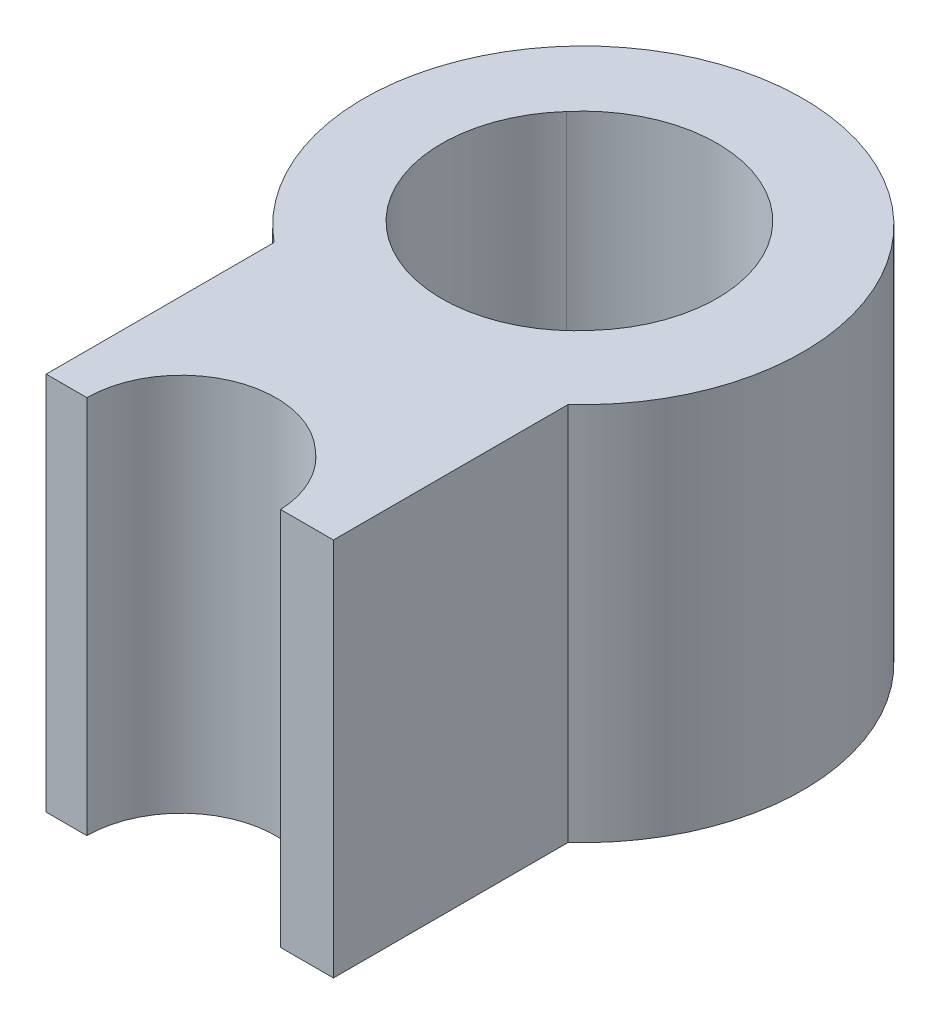
ISO-10303-21;
HEADER;
FILE_DESCRIPTION(('STEP AP214'),'2;1');
FILE_NAME('part.step','',(''),(''),'','','');
FILE_SCHEMA(('AUTOMOTIVE_DESIGN { 1 0 10303 214 1 1 1 1 }'));
ENDSEC;
DATA;
#1=APPLICATION_CONTEXT('core data for automotive mechanical design processes');
#2=APPLICATION_PROTOCOL_DEFINITION('international standard','automotive_design',2000,#1);
#3=PRODUCT_CONTEXT('',#1,'mechanical');
#4=PRODUCT('Part','Part','',(#3));
#5=PRODUCT_RELATED_PRODUCT_CATEGORY('part','',(#4));
#6=PRODUCT_DEFINITION_FORMATION('','',#4);
#7=PRODUCT_DEFINITION_CONTEXT('part definition',#1,'design');
#8=PRODUCT_DEFINITION('design','',#6,#7);
#9=PRODUCT_DEFINITION_SHAPE('','',#8);
#10=(LENGTH_UNIT() NAMED_UNIT(*) SI_UNIT(.MILLI.,.METRE.));
#11=(NAMED_UNIT(*) PLANE_ANGLE_UNIT() SI_UNIT($,.RADIAN.));
#12=(NAMED_UNIT(*) SI_UNIT($,.STERADIAN.) SOLID_ANGLE_UNIT());
#13=UNCERTAINTY_MEASURE_WITH_UNIT(LENGTH_MEASURE(1.E-05),#10,'distance_accuracy_value','');
#14=(GEOMETRIC_REPRESENTATION_CONTEXT(3) GLOBAL_UNCERTAINTY_ASSIGNED_CONTEXT((#13)) GLOBAL_UNIT_ASSIGNED_CONTEXT((#10,
#11,#12)) REPRESENTATION_CONTEXT('',''));
#15=CARTESIAN_POINT('',(0.,0.,0.));
#16=DIRECTION('',(0.,0.,1.));
#17=DIRECTION('',(1.,0.,0.));
#18=AXIS2_PLACEMENT_3D('',#15,#16,#17);
#19=CARTESIAN_POINT('',(1.26536763995187,2.87183105039429,15.59112871048));
#20=DIRECTION('',(0.,1.,0.));
#21=DIRECTION('',(0.,0.,-1.));
#22=AXIS2_PLACEMENT_3D('',#19,#20,#21);
#23=PLANE('',#22);
#24=CARTESIAN_POINT('',(8.79646763995186,2.87183105039429,23.1984287104753));
#25=DIRECTION('',(0.,1.,0.));
#26=DIRECTION('',(0.,0.,1.));
#27=AXIS2_PLACEMENT_3D('',#24,#25,#26);
#28=CIRCLE('',#27,0.425);
#29=CARTESIAN_POINT('',(9.11195209342926,2.87183105039429,23.4831997757434));
#30=VERTEX_POINT('',#29);
#31=CARTESIAN_POINT('',(8.47099563300775,2.87183105039429,22.9251285591841));
#32=VERTEX_POINT('',#31);
#33=EDGE_CURVE('E116',#30,#32,#28,.T.);
#34=ORIENTED_EDGE('',*,*,#33,.F.);
#35=CARTESIAN_POINT('',(8.78648008648218,2.87183105039429,23.2098996244558));
#36=DIRECTION('',(0.,1.,0.));
#37=DIRECTION('',(0.,0.,1.));
#38=AXIS2_PLACEMENT_3D('',#35,#36,#37);
#39=CIRCLE('',#38,0.425);
#40=EDGE_CURVE('E121',#32,#30,#39,.T.);
#41=ORIENTED_EDGE('',*,*,#40,.F.);
#42=EDGE_LOOP('',(#34,#41));
#43=FACE_BOUND('',#42,.T.);
#44=CARTESIAN_POINT('',(8.80956287338156,2.87183105039429,24.4798996244558));
#45=DIRECTION('',(0.,1.,0.));
#46=DIRECTION('',(0.999103542626486,0.,-0.0423333333344553));
#47=AXIS2_PLACEMENT_3D('',#44,#45,#46);
#48=CIRCLE('',#47,0.299999999999992);
#49=CARTESIAN_POINT('',(9.1092939361695,2.87183105039429,24.4671996244555));
#50=VERTEX_POINT('',#49);
#51=CARTESIAN_POINT('',(9.00060621398111,2.87183105039429,24.2485936755212));
#52=VERTEX_POINT('',#51);
#53=EDGE_CURVE('E167',#50,#52,#48,.T.);
#54=ORIENTED_EDGE('',*,*,#53,.F.);
#55=DIRECTION('',(-1.,0.,-1.06337566312106E-12));
#56=VECTOR('',#55,1.);
#57=CARTESIAN_POINT('',(9.27637767726418,2.87183105039429,24.4671996244556));
#58=LINE('',#57,#56);
#59=CARTESIAN_POINT('',(9.27637767726418,2.87183105039429,24.4671996244556));
#60=VERTEX_POINT('',#59);
#61=EDGE_CURVE('E175',#60,#50,#58,.T.);
#62=ORIENTED_EDGE('',*,*,#61,.F.);
#63=DIRECTION('',(5.02522919053297E-13,0.,-1.));
#64=VECTOR('',#63,1.);
#65=CARTESIAN_POINT('',(9.27637767726418,2.87183105039429,24.4671996244556));
#66=LINE('',#65,#64);
#67=CARTESIAN_POINT('',(9.27637767726455,2.87183105039429,23.7245472516448));
#68=VERTEX_POINT('',#67);
#69=EDGE_CURVE('E26',#60,#68,#66,.T.);
#70=ORIENTED_EDGE('',*,*,#69,.T.);
#71=CARTESIAN_POINT('',(8.80956287338154,2.87183105039429,23.2098996244558));
#72=DIRECTION('',(0.,1.,0.));
#73=DIRECTION('',(0.,0.,1.));
#74=AXIS2_PLACEMENT_3D('',#71,#72,#73);
#75=CIRCLE('',#74,0.694822453073876);
#76=CARTESIAN_POINT('',(8.36768378450207,2.87183105039429,23.7461095759735));
#77=VERTEX_POINT('',#76);
#78=EDGE_CURVE('E11',#68,#77,#75,.T.);
#79=ORIENTED_EDGE('',*,*,#78,.T.);
#80=DIRECTION('',(-5.6636748734305E-13,0.,-1.));
#81=VECTOR('',#80,1.);
#82=CARTESIAN_POINT('',(8.36768378450248,2.87183105039429,24.467199624456));
#83=LINE('',#82,#81);
#84=CARTESIAN_POINT('',(8.36768378450248,2.87183105039429,24.467199624456));
#85=VERTEX_POINT('',#84);
#86=EDGE_CURVE('E147',#85,#77,#83,.T.);
#87=ORIENTED_EDGE('',*,*,#86,.F.);
#88=DIRECTION('',(1.,0.,-1.62432664225037E-12));
#89=VECTOR('',#88,1.);
#90=CARTESIAN_POINT('',(8.36768378450248,2.87183105039429,24.467199624456));
#91=LINE('',#90,#89);
#92=CARTESIAN_POINT('',(8.49647015771649,2.87183105039429,24.4671996244558));
#93=VERTEX_POINT('',#92);
#94=EDGE_CURVE('E156',#85,#93,#91,.T.);
#95=ORIENTED_EDGE('',*,*,#94,.T.);
#96=CARTESIAN_POINT('',(8.79646763995186,2.87183105039429,24.4684287104753));
#97=DIRECTION('',(0.,1.,0.));
#98=DIRECTION('',(0.999103542626549,0.,0.0423333333329731));
#99=AXIS2_PLACEMENT_3D('',#96,#97,#98);
#100=CIRCLE('',#99,0.300000000000009);
#101=EDGE_CURVE('E161',#52,#93,#100,.T.);
#102=ORIENTED_EDGE('',*,*,#101,.F.);
#103=EDGE_LOOP('',(#54,#62,#70,#79,#87,#95,#102));
#104=FACE_BOUND('',#103,.T.);
#105=ADVANCED_FACE('F17',(#43,#104),#23,.T.);
#106=CARTESIAN_POINT('',(8.80956287338154,2.87183105039429,23.2098996244558));
#107=DIRECTION('',(0.,-1.,0.));
#108=DIRECTION('',(-0.0237222420047687,0.,-0.999718588020783));
#109=AXIS2_PLACEMENT_3D('',#106,#107,#108);
#110=CYLINDRICAL_SURFACE('',#109,0.694822453073876);
#111=CARTESIAN_POINT('',(8.80956287338154,1.6718310055699,23.2098996244558));
#112=DIRECTION('',(0.,1.,0.));
#113=DIRECTION('',(0.,0.,1.));
#114=AXIS2_PLACEMENT_3D('',#111,#112,#113);
#115=CIRCLE('',#114,0.694822453073876);
#116=CARTESIAN_POINT('',(9.27637767726456,1.6718310055699,23.7245472516448));
#117=VERTEX_POINT('',#116);
#118=CARTESIAN_POINT('',(8.36768378450208,1.6718310055699,23.7461095759735));
#119=VERTEX_POINT('',#118);
#120=EDGE_CURVE('E192',#117,#119,#115,.T.);
#121=ORIENTED_EDGE('',*,*,#120,.T.);
#122=DIRECTION('',(0.,-1.,0.));
#123=VECTOR('',#122,1.);
#124=CARTESIAN_POINT('',(8.36768378450207,2.87183105039429,23.7461095759735));
#125=LINE('',#124,#123);
#126=EDGE_CURVE('E144',#77,#119,#125,.T.);
#127=ORIENTED_EDGE('',*,*,#126,.F.);
#128=ORIENTED_EDGE('',*,*,#78,.F.);
#129=DIRECTION('',(0.,-1.,0.));
#130=VECTOR('',#129,1.);
#131=CARTESIAN_POINT('',(9.27637767726455,2.87183105039429,23.7245472516448));
#132=LINE('',#131,#130);
#133=EDGE_CURVE('E178',#68,#117,#132,.T.);
#134=ORIENTED_EDGE('',*,*,#133,.T.);
#135=EDGE_LOOP('',(#121,#127,#128,#134));
#136=FACE_BOUND('',#135,.T.);
#137=ADVANCED_FACE('F191',(#136),#110,.T.);
#138=CARTESIAN_POINT('',(9.27637767726455,2.87183105039429,23.7245472516448));
#139=DIRECTION('',(1.,0.,5.02522919053297E-13));
#140=DIRECTION('',(-5.02522919053297E-13,0.,1.));
#141=AXIS2_PLACEMENT_3D('',#138,#139,#140);
#142=PLANE('',#141);
#143=DIRECTION('',(5.02522919053297E-13,0.,-1.));
#144=VECTOR('',#143,1.);
#145=CARTESIAN_POINT('',(9.2763776772666,1.6718310055699,19.6578379810644));
#146=LINE('',#145,#144);
#147=CARTESIAN_POINT('',(9.27637767726419,1.6718310055699,24.4671996244556));
#148=VERTEX_POINT('',#147);
#149=EDGE_CURVE('E140',#148,#117,#146,.T.);
#150=ORIENTED_EDGE('',*,*,#149,.T.);
#151=ORIENTED_EDGE('',*,*,#133,.F.);
#152=ORIENTED_EDGE('',*,*,#69,.F.);
#153=DIRECTION('',(0.,-1.,0.));
#154=VECTOR('',#153,1.);
#155=CARTESIAN_POINT('',(9.27637767726418,2.87183105039429,24.4671996244556));
#156=LINE('',#155,#154);
#157=EDGE_CURVE('E172',#60,#148,#156,.T.);
#158=ORIENTED_EDGE('',*,*,#157,.T.);
#159=EDGE_LOOP('',(#150,#151,#152,#158));
#160=FACE_BOUND('',#159,.T.);
#161=ADVANCED_FACE('F19',(#160),#142,.T.);
#162=CARTESIAN_POINT('',(9.27637767726418,2.87183105039429,24.4671996244556));
#163=DIRECTION('',(-1.06337566312106E-12,0.,1.));
#164=DIRECTION('',(1.,0.,1.06337566312106E-12));
#165=AXIS2_PLACEMENT_3D('',#162,#163,#164);
#166=PLANE('',#165);
#167=DIRECTION('',(1.,0.,1.06337566312106E-12));
#168=VECTOR('',#167,1.);
#169=CARTESIAN_POINT('',(5.27087265860331,1.6718310055699,24.4671996244514));
#170=LINE('',#169,#168);
#171=CARTESIAN_POINT('',(9.1092939361695,1.6718310055699,24.4671996244555));
#172=VERTEX_POINT('',#171);
#173=EDGE_CURVE('E133',#172,#148,#170,.T.);
#174=ORIENTED_EDGE('',*,*,#173,.T.);
#175=ORIENTED_EDGE('',*,*,#157,.F.);
#176=ORIENTED_EDGE('',*,*,#61,.T.);
#177=DIRECTION('',(0.,-1.,0.));
#178=VECTOR('',#177,1.);
#179=CARTESIAN_POINT('',(9.1092939361695,2.87183105039429,24.4671996244555));
#180=LINE('',#179,#178);
#181=EDGE_CURVE('E164',#50,#172,#180,.T.);
#182=ORIENTED_EDGE('',*,*,#181,.T.);
#183=EDGE_LOOP('',(#174,#175,#176,#182));
#184=FACE_BOUND('',#183,.T.);
#185=ADVANCED_FACE('F242',(#184),#166,.T.);
#186=CARTESIAN_POINT('',(8.79646763995186,2.87183105039429,23.1984287104753));
#187=DIRECTION('',(0.,-1.,0.));
#188=DIRECTION('',(0.65665950684178,0.,-0.754187173103806));
#189=AXIS2_PLACEMENT_3D('',#186,#187,#188);
#190=CYLINDRICAL_SURFACE('',#189,0.425);
#191=CARTESIAN_POINT('',(8.79646763995186,1.6718310055699,23.1984287104753));
#192=DIRECTION('',(0.,-1.,0.));
#193=DIRECTION('',(0.,0.,1.));
#194=AXIS2_PLACEMENT_3D('',#191,#192,#193);
#195=CIRCLE('',#194,0.425);
#196=CARTESIAN_POINT('',(8.47099563300775,1.6718310055699,22.9251285591841));
#197=VERTEX_POINT('',#196);
#198=CARTESIAN_POINT('',(9.11195209342927,1.6718310055699,23.4831997757434));
#199=VERTEX_POINT('',#198);
#200=EDGE_CURVE('E115',#197,#199,#195,.T.);
#201=ORIENTED_EDGE('',*,*,#200,.T.);
#202=DIRECTION('',(0.,-1.,0.));
#203=VECTOR('',#202,1.);
#204=CARTESIAN_POINT('',(9.11195209342926,2.87183105039429,23.4831997757434));
#205=LINE('',#204,#203);
#206=EDGE_CURVE('E126',#30,#199,#205,.T.);
#207=ORIENTED_EDGE('',*,*,#206,.F.);
#208=ORIENTED_EDGE('',*,*,#33,.T.);
#209=DIRECTION('',(0.,-1.,0.));
#210=VECTOR('',#209,1.);
#211=CARTESIAN_POINT('',(8.47099563300775,2.87183105039429,22.9251285591841));
#212=LINE('',#211,#210);
#213=EDGE_CURVE('E110',#32,#197,#212,.T.);
#214=ORIENTED_EDGE('',*,*,#213,.T.);
#215=EDGE_LOOP('',(#201,#207,#208,#214));
#216=FACE_BOUND('',#215,.T.);
#217=ADVANCED_FACE('F112',(#216),#190,.F.);
#218=CARTESIAN_POINT('',(8.80956287338156,2.87183105039429,24.4798996244558));
#219=DIRECTION('',(0.,-1.,0.));
#220=DIRECTION('',(0.999103542626486,0.,-0.0423333333344553));
#221=AXIS2_PLACEMENT_3D('',#218,#219,#220);
#222=CYLINDRICAL_SURFACE('',#221,0.299999999999992);
#223=CARTESIAN_POINT('',(8.80956287338156,1.6718310055699,24.4798996244558));
#224=DIRECTION('',(0.,-1.,0.));
#225=DIRECTION('',(0.999103542626486,0.,-0.0423333333344553));
#226=AXIS2_PLACEMENT_3D('',#223,#224,#225);
#227=CIRCLE('',#226,0.299999999999992);
#228=CARTESIAN_POINT('',(9.00060621398112,1.6718310055699,24.2485936755212));
#229=VERTEX_POINT('',#228);
#230=EDGE_CURVE('E214',#229,#172,#227,.T.);
#231=ORIENTED_EDGE('',*,*,#230,.T.);
#232=ORIENTED_EDGE('',*,*,#181,.F.);
#233=ORIENTED_EDGE('',*,*,#53,.T.);
#234=DIRECTION('',(0.,-1.,0.));
#235=VECTOR('',#234,1.);
#236=CARTESIAN_POINT('',(9.00060621398111,2.87183105039429,24.2485936755212));
#237=LINE('',#236,#235);
#238=EDGE_CURVE('E160',#52,#229,#237,.T.);
#239=ORIENTED_EDGE('',*,*,#238,.T.);
#240=EDGE_LOOP('',(#231,#232,#233,#239));
#241=FACE_BOUND('',#240,.T.);
#242=ADVANCED_FACE('F238',(#241),#222,.F.);
#243=CARTESIAN_POINT('',(8.79646763995186,2.87183105039429,24.4684287104753));
#244=DIRECTION('',(0.,-1.,0.));
#245=DIRECTION('',(-0.39783263926798,0.,-0.917458005105996));
#246=AXIS2_PLACEMENT_3D('',#243,#244,#245);
#247=CYLINDRICAL_SURFACE('',#246,0.300000000000009);
#248=CARTESIAN_POINT('',(8.79646763995186,1.6718310055699,24.4684287104753));
#249=DIRECTION('',(0.,-1.,0.));
#250=DIRECTION('',(0.999103542626549,0.,0.0423333333329731));
#251=AXIS2_PLACEMENT_3D('',#248,#249,#250);
#252=CIRCLE('',#251,0.300000000000009);
#253=CARTESIAN_POINT('',(8.4964701577165,1.6718310055699,24.4671996244558));
#254=VERTEX_POINT('',#253);
#255=EDGE_CURVE('E211',#254,#229,#252,.T.);
#256=ORIENTED_EDGE('',*,*,#255,.T.);
#257=ORIENTED_EDGE('',*,*,#238,.F.);
#258=ORIENTED_EDGE('',*,*,#101,.T.);
#259=DIRECTION('',(0.,-1.,0.));
#260=VECTOR('',#259,1.);
#261=CARTESIAN_POINT('',(8.49647015771649,2.87183105039429,24.4671996244558));
#262=LINE('',#261,#260);
#263=EDGE_CURVE('E146',#93,#254,#262,.T.);
#264=ORIENTED_EDGE('',*,*,#263,.T.);
#265=EDGE_LOOP('',(#256,#257,#258,#264));
#266=FACE_BOUND('',#265,.T.);
#267=ADVANCED_FACE('F236',(#266),#247,.F.);
#268=CARTESIAN_POINT('',(8.49647015771649,2.87183105039429,24.4671996244558));
#269=DIRECTION('',(1.62432664225037E-12,0.,1.));
#270=DIRECTION('',(1.,0.,-1.62432664225037E-12));
#271=AXIS2_PLACEMENT_3D('',#268,#269,#270);
#272=PLANE('',#271);
#273=DIRECTION('',(1.,0.,-1.62432664225037E-12));
#274=VECTOR('',#273,1.);
#275=CARTESIAN_POINT('',(4.88091889884139,1.6718310055699,24.4671996244617));
#276=LINE('',#275,#274);
#277=CARTESIAN_POINT('',(8.36768378450249,1.6718310055699,24.467199624456));
#278=VERTEX_POINT('',#277);
#279=EDGE_CURVE('E203',#278,#254,#276,.T.);
#280=ORIENTED_EDGE('',*,*,#279,.T.);
#281=ORIENTED_EDGE('',*,*,#263,.F.);
#282=ORIENTED_EDGE('',*,*,#94,.F.);
#283=DIRECTION('',(0.,-1.,0.));
#284=VECTOR('',#283,1.);
#285=CARTESIAN_POINT('',(8.36768378450248,2.87183105039429,24.467199624456));
#286=LINE('',#285,#284);
#287=EDGE_CURVE('E151',#85,#278,#286,.T.);
#288=ORIENTED_EDGE('',*,*,#287,.T.);
#289=EDGE_LOOP('',(#280,#281,#282,#288));
#290=FACE_BOUND('',#289,.T.);
#291=ADVANCED_FACE('F234',(#290),#272,.T.);
#292=CARTESIAN_POINT('',(8.36768378450248,2.87183105039429,24.467199624456));
#293=DIRECTION('',(-1.,0.,5.6636748734305E-13));
#294=DIRECTION('',(0.,1.,0.));
#295=AXIS2_PLACEMENT_3D('',#292,#293,#294);
#296=PLANE('',#295);
#297=DIRECTION('',(5.6636748734305E-13,0.,1.));
#298=VECTOR('',#297,1.);
#299=CARTESIAN_POINT('',(8.36768378449996,1.6718310055699,20.029164167466));
#300=LINE('',#299,#298);
#301=EDGE_CURVE('E196',#119,#278,#300,.T.);
#302=ORIENTED_EDGE('',*,*,#301,.T.);
#303=ORIENTED_EDGE('',*,*,#287,.F.);
#304=ORIENTED_EDGE('',*,*,#86,.T.);
#305=ORIENTED_EDGE('',*,*,#126,.T.);
#306=EDGE_LOOP('',(#302,#303,#304,#305));
#307=FACE_BOUND('',#306,.T.);
#308=ADVANCED_FACE('F229',(#307),#296,.T.);
#309=CARTESIAN_POINT('',(8.78648008648218,2.87183105039429,23.2098996244558));
#310=DIRECTION('',(0.,-1.,0.));
#311=DIRECTION('',(0.,0.,1.));
#312=AXIS2_PLACEMENT_3D('',#309,#310,#311);
#313=CYLINDRICAL_SURFACE('',#312,0.425);
#314=CARTESIAN_POINT('',(8.78648008648218,1.6718310055699,23.2098996244558));
#315=DIRECTION('',(0.,-1.,0.));
#316=DIRECTION('',(0.,0.,1.));
#317=AXIS2_PLACEMENT_3D('',#314,#315,#316);
#318=CIRCLE('',#317,0.425);
#319=EDGE_CURVE('E122',#199,#197,#318,.T.);
#320=ORIENTED_EDGE('',*,*,#319,.T.);
#321=ORIENTED_EDGE('',*,*,#213,.F.);
#322=ORIENTED_EDGE('',*,*,#40,.T.);
#323=ORIENTED_EDGE('',*,*,#206,.T.);
#324=EDGE_LOOP('',(#320,#321,#322,#323));
#325=FACE_BOUND('',#324,.T.);
#326=ADVANCED_FACE('F125',(#325),#313,.F.);
#327=CARTESIAN_POINT('',(1.26536763995188,1.6718310055699,15.59112871048));
#328=DIRECTION('',(0.,1.,0.));
#329=DIRECTION('',(0.,0.,-1.));
#330=AXIS2_PLACEMENT_3D('',#327,#328,#329);
#331=PLANE('',#330);
#332=ORIENTED_EDGE('',*,*,#200,.F.);
#333=ORIENTED_EDGE('',*,*,#319,.F.);
#334=EDGE_LOOP('',(#332,#333));
#335=FACE_BOUND('',#334,.T.);
#336=ORIENTED_EDGE('',*,*,#230,.F.);
#337=ORIENTED_EDGE('',*,*,#255,.F.);
#338=ORIENTED_EDGE('',*,*,#279,.F.);
#339=ORIENTED_EDGE('',*,*,#301,.F.);
#340=ORIENTED_EDGE('',*,*,#120,.F.);
#341=ORIENTED_EDGE('',*,*,#149,.F.);
#342=ORIENTED_EDGE('',*,*,#173,.F.);
#343=EDGE_LOOP('',(#336,#337,#338,#339,#340,#341,#342));
#344=FACE_BOUND('',#343,.T.);
#345=ADVANCED_FACE('F130',(#335,#344),#331,.F.);
#346=CLOSED_SHELL('',(#105,#137,#161,#185,#217,#242,#267,#291,#308,#326,#345));
#347=MANIFOLD_SOLID_BREP('B1',#346);
#348=ADVANCED_BREP_SHAPE_REPRESENTATION('',(#18,#347),#14);
#349=SHAPE_DEFINITION_REPRESENTATION(#9,#348);
ENDSEC;
END-ISO-10303-21;
